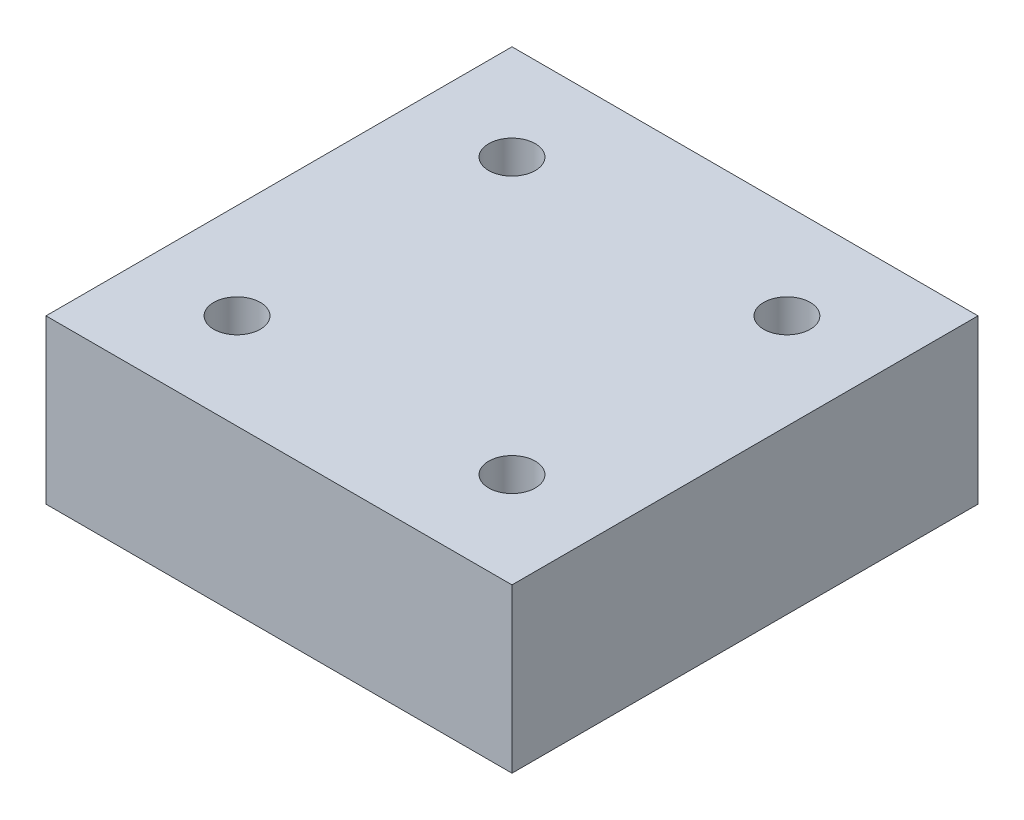
ISO-10303-21;
HEADER;
FILE_DESCRIPTION(('STEP AP214'),'2;1');
FILE_NAME('part.step','',(''),(''),'','','');
FILE_SCHEMA(('AUTOMOTIVE_DESIGN { 1 0 10303 214 1 1 1 1 }'));
ENDSEC;
DATA;
#1=APPLICATION_CONTEXT('core data for automotive mechanical design processes');
#2=APPLICATION_PROTOCOL_DEFINITION('international standard','automotive_design',2000,#1);
#3=PRODUCT_CONTEXT('',#1,'mechanical');
#4=PRODUCT('Part','Part','',(#3));
#5=PRODUCT_RELATED_PRODUCT_CATEGORY('part','',(#4));
#6=PRODUCT_DEFINITION_FORMATION('','',#4);
#7=PRODUCT_DEFINITION_CONTEXT('part definition',#1,'design');
#8=PRODUCT_DEFINITION('design','',#6,#7);
#9=PRODUCT_DEFINITION_SHAPE('','',#8);
#10=(LENGTH_UNIT() NAMED_UNIT(*) SI_UNIT(.MILLI.,.METRE.));
#11=(NAMED_UNIT(*) PLANE_ANGLE_UNIT() SI_UNIT($,.RADIAN.));
#12=(NAMED_UNIT(*) SI_UNIT($,.STERADIAN.) SOLID_ANGLE_UNIT());
#13=UNCERTAINTY_MEASURE_WITH_UNIT(LENGTH_MEASURE(1.E-05),#10,'distance_accuracy_value','');
#14=(GEOMETRIC_REPRESENTATION_CONTEXT(3) GLOBAL_UNCERTAINTY_ASSIGNED_CONTEXT((#13)) GLOBAL_UNIT_ASSIGNED_CONTEXT((#10,
#11,#12)) REPRESENTATION_CONTEXT('',''));
#15=CARTESIAN_POINT('',(0.,0.,0.));
#16=DIRECTION('',(0.,0.,1.));
#17=DIRECTION('',(1.,0.,0.));
#18=AXIS2_PLACEMENT_3D('',#15,#16,#17);
#19=CARTESIAN_POINT('',(25.4,17.78,25.4));
#20=DIRECTION('',(-1.,0.,0.));
#21=DIRECTION('',(0.,0.,1.));
#22=AXIS2_PLACEMENT_3D('',#19,#20,#21);
#23=PLANE('',#22);
#24=DIRECTION('',(0.,0.,-1.));
#25=VECTOR('',#24,1.);
#26=CARTESIAN_POINT('',(25.4,0.,25.4));
#27=LINE('',#26,#25);
#28=CARTESIAN_POINT('',(25.4,0.,25.4));
#29=VERTEX_POINT('',#28);
#30=CARTESIAN_POINT('',(25.4,0.,-25.4));
#31=VERTEX_POINT('',#30);
#32=EDGE_CURVE('E96',#29,#31,#27,.T.);
#33=ORIENTED_EDGE('',*,*,#32,.T.);
#34=DIRECTION('',(0.,-1.,0.));
#35=VECTOR('',#34,1.);
#36=CARTESIAN_POINT('',(25.4,17.78,-25.4));
#37=LINE('',#36,#35);
#38=CARTESIAN_POINT('',(25.4,17.78,-25.4));
#39=VERTEX_POINT('',#38);
#40=EDGE_CURVE('E11',#39,#31,#37,.T.);
#41=ORIENTED_EDGE('',*,*,#40,.F.);
#42=DIRECTION('',(0.,0.,-1.));
#43=VECTOR('',#42,1.);
#44=CARTESIAN_POINT('',(25.4,17.78,25.4));
#45=LINE('',#44,#43);
#46=CARTESIAN_POINT('',(25.4,17.78,25.4));
#47=VERTEX_POINT('',#46);
#48=EDGE_CURVE('E84',#47,#39,#45,.T.);
#49=ORIENTED_EDGE('',*,*,#48,.F.);
#50=DIRECTION('',(0.,-1.,0.));
#51=VECTOR('',#50,1.);
#52=CARTESIAN_POINT('',(25.4,17.78,25.4));
#53=LINE('',#52,#51);
#54=EDGE_CURVE('E92',#47,#29,#53,.T.);
#55=ORIENTED_EDGE('',*,*,#54,.T.);
#56=EDGE_LOOP('',(#33,#41,#49,#55));
#57=FACE_BOUND('',#56,.T.);
#58=ADVANCED_FACE('F33',(#57),#23,.F.);
#59=CARTESIAN_POINT('',(-25.4,17.78,-25.4));
#60=DIRECTION('',(0.,0.,1.));
#61=DIRECTION('',(1.,0.,0.));
#62=AXIS2_PLACEMENT_3D('',#59,#60,#61);
#63=PLANE('',#62);
#64=DIRECTION('',(-1.,0.,0.));
#65=VECTOR('',#64,1.);
#66=CARTESIAN_POINT('',(-25.4,0.,-25.4));
#67=LINE('',#66,#65);
#68=CARTESIAN_POINT('',(-25.4,0.,-25.4));
#69=VERTEX_POINT('',#68);
#70=EDGE_CURVE('E88',#31,#69,#67,.T.);
#71=ORIENTED_EDGE('',*,*,#70,.T.);
#72=DIRECTION('',(0.,-1.,0.));
#73=VECTOR('',#72,1.);
#74=CARTESIAN_POINT('',(-25.4,17.78,-25.4));
#75=LINE('',#74,#73);
#76=CARTESIAN_POINT('',(-25.4,17.78,-25.4));
#77=VERTEX_POINT('',#76);
#78=EDGE_CURVE('E41',#77,#69,#75,.T.);
#79=ORIENTED_EDGE('',*,*,#78,.F.);
#80=DIRECTION('',(-1.,0.,0.));
#81=VECTOR('',#80,1.);
#82=CARTESIAN_POINT('',(-25.4,17.78,-25.4));
#83=LINE('',#82,#81);
#84=EDGE_CURVE('E79',#39,#77,#83,.T.);
#85=ORIENTED_EDGE('',*,*,#84,.F.);
#86=ORIENTED_EDGE('',*,*,#40,.T.);
#87=EDGE_LOOP('',(#71,#79,#85,#86));
#88=FACE_BOUND('',#87,.T.);
#89=ADVANCED_FACE('F87',(#88),#63,.F.);
#90=CARTESIAN_POINT('',(-25.4,17.78,25.4));
#91=DIRECTION('',(1.,0.,0.));
#92=DIRECTION('',(0.,0.,-1.));
#93=AXIS2_PLACEMENT_3D('',#90,#91,#92);
#94=PLANE('',#93);
#95=DIRECTION('',(0.,0.,1.));
#96=VECTOR('',#95,1.);
#97=CARTESIAN_POINT('',(-25.4,0.,25.4));
#98=LINE('',#97,#96);
#99=CARTESIAN_POINT('',(-25.4,0.,25.4));
#100=VERTEX_POINT('',#99);
#101=EDGE_CURVE('E66',#69,#100,#98,.T.);
#102=ORIENTED_EDGE('',*,*,#101,.T.);
#103=DIRECTION('',(0.,-1.,0.));
#104=VECTOR('',#103,1.);
#105=CARTESIAN_POINT('',(-25.4,17.78,25.4));
#106=LINE('',#105,#104);
#107=CARTESIAN_POINT('',(-25.4,17.78,25.4));
#108=VERTEX_POINT('',#107);
#109=EDGE_CURVE('E89',#108,#100,#106,.T.);
#110=ORIENTED_EDGE('',*,*,#109,.F.);
#111=DIRECTION('',(0.,0.,1.));
#112=VECTOR('',#111,1.);
#113=CARTESIAN_POINT('',(-25.4,17.78,25.4));
#114=LINE('',#113,#112);
#115=EDGE_CURVE('E82',#77,#108,#114,.T.);
#116=ORIENTED_EDGE('',*,*,#115,.F.);
#117=ORIENTED_EDGE('',*,*,#78,.T.);
#118=EDGE_LOOP('',(#102,#110,#116,#117));
#119=FACE_BOUND('',#118,.T.);
#120=ADVANCED_FACE('F90',(#119),#94,.F.);
#121=CARTESIAN_POINT('',(-25.4,17.78,25.4));
#122=DIRECTION('',(0.,0.,-1.));
#123=DIRECTION('',(-1.,0.,0.));
#124=AXIS2_PLACEMENT_3D('',#121,#122,#123);
#125=PLANE('',#124);
#126=DIRECTION('',(1.,0.,0.));
#127=VECTOR('',#126,1.);
#128=CARTESIAN_POINT('',(-25.4,0.,25.4));
#129=LINE('',#128,#127);
#130=EDGE_CURVE('E72',#100,#29,#129,.T.);
#131=ORIENTED_EDGE('',*,*,#130,.T.);
#132=ORIENTED_EDGE('',*,*,#54,.F.);
#133=DIRECTION('',(1.,0.,0.));
#134=VECTOR('',#133,1.);
#135=CARTESIAN_POINT('',(-25.4,17.78,25.4));
#136=LINE('',#135,#134);
#137=EDGE_CURVE('E49',#108,#47,#136,.T.);
#138=ORIENTED_EDGE('',*,*,#137,.F.);
#139=ORIENTED_EDGE('',*,*,#109,.T.);
#140=EDGE_LOOP('',(#131,#132,#138,#139));
#141=FACE_BOUND('',#140,.T.);
#142=ADVANCED_FACE('F104',(#141),#125,.F.);
#143=CARTESIAN_POINT('',(0.,17.78,0.));
#144=DIRECTION('',(0.,-1.,0.));
#145=DIRECTION('',(0.,0.,-1.));
#146=AXIS2_PLACEMENT_3D('',#143,#144,#145);
#147=PLANE('',#146);
#148=CARTESIAN_POINT('',(-14.986,17.78,14.986));
#149=DIRECTION('',(0.,1.,0.));
#150=DIRECTION('',(0.,0.,1.));
#151=AXIS2_PLACEMENT_3D('',#148,#149,#150);
#152=CIRCLE('',#151,2.54);
#153=CARTESIAN_POINT('',(-14.986,17.78,17.526));
#154=VERTEX_POINT('',#153);
#155=EDGE_CURVE('E116',#154,#154,#152,.T.);
#156=ORIENTED_EDGE('',*,*,#155,.F.);
#157=EDGE_LOOP('',(#156));
#158=FACE_BOUND('',#157,.T.);
#159=CARTESIAN_POINT('',(14.986,17.78,14.986));
#160=DIRECTION('',(0.,1.,0.));
#161=DIRECTION('',(0.,0.,1.));
#162=AXIS2_PLACEMENT_3D('',#159,#160,#161);
#163=CIRCLE('',#162,2.54);
#164=CARTESIAN_POINT('',(14.986,17.78,17.526));
#165=VERTEX_POINT('',#164);
#166=EDGE_CURVE('E122',#165,#165,#163,.T.);
#167=ORIENTED_EDGE('',*,*,#166,.F.);
#168=EDGE_LOOP('',(#167));
#169=FACE_BOUND('',#168,.T.);
#170=CARTESIAN_POINT('',(14.986,17.78,-14.986));
#171=DIRECTION('',(0.,1.,0.));
#172=DIRECTION('',(0.,0.,1.));
#173=AXIS2_PLACEMENT_3D('',#170,#171,#172);
#174=CIRCLE('',#173,2.54);
#175=CARTESIAN_POINT('',(14.986,17.78,-12.446));
#176=VERTEX_POINT('',#175);
#177=EDGE_CURVE('E128',#176,#176,#174,.T.);
#178=ORIENTED_EDGE('',*,*,#177,.F.);
#179=EDGE_LOOP('',(#178));
#180=FACE_BOUND('',#179,.T.);
#181=CARTESIAN_POINT('',(-14.986,17.78,-14.986));
#182=DIRECTION('',(0.,1.,0.));
#183=DIRECTION('',(0.,0.,1.));
#184=AXIS2_PLACEMENT_3D('',#181,#182,#183);
#185=CIRCLE('',#184,2.54);
#186=CARTESIAN_POINT('',(-14.986,17.78,-12.446));
#187=VERTEX_POINT('',#186);
#188=EDGE_CURVE('E110',#187,#187,#185,.T.);
#189=ORIENTED_EDGE('',*,*,#188,.F.);
#190=EDGE_LOOP('',(#189));
#191=FACE_BOUND('',#190,.T.);
#192=ORIENTED_EDGE('',*,*,#48,.T.);
#193=ORIENTED_EDGE('',*,*,#84,.T.);
#194=ORIENTED_EDGE('',*,*,#115,.T.);
#195=ORIENTED_EDGE('',*,*,#137,.T.);
#196=EDGE_LOOP('',(#192,#193,#194,#195));
#197=FACE_BOUND('',#196,.T.);
#198=ADVANCED_FACE('F80',(#158,#169,#180,#191,#197),#147,.F.);
#199=CARTESIAN_POINT('',(0.,0.,0.));
#200=DIRECTION('',(0.,-1.,0.));
#201=DIRECTION('',(0.,0.,-1.));
#202=AXIS2_PLACEMENT_3D('',#199,#200,#201);
#203=PLANE('',#202);
#204=CARTESIAN_POINT('',(-14.986,0.,14.986));
#205=DIRECTION('',(0.,1.,0.));
#206=DIRECTION('',(0.,0.,1.));
#207=AXIS2_PLACEMENT_3D('',#204,#205,#206);
#208=CIRCLE('',#207,2.54);
#209=CARTESIAN_POINT('',(-14.986,0.,17.526));
#210=VERTEX_POINT('',#209);
#211=EDGE_CURVE('E119',#210,#210,#208,.T.);
#212=ORIENTED_EDGE('',*,*,#211,.T.);
#213=EDGE_LOOP('',(#212));
#214=FACE_BOUND('',#213,.T.);
#215=CARTESIAN_POINT('',(14.986,0.,14.986));
#216=DIRECTION('',(0.,1.,0.));
#217=DIRECTION('',(0.,0.,1.));
#218=AXIS2_PLACEMENT_3D('',#215,#216,#217);
#219=CIRCLE('',#218,2.54);
#220=CARTESIAN_POINT('',(14.986,0.,17.526));
#221=VERTEX_POINT('',#220);
#222=EDGE_CURVE('E125',#221,#221,#219,.T.);
#223=ORIENTED_EDGE('',*,*,#222,.T.);
#224=EDGE_LOOP('',(#223));
#225=FACE_BOUND('',#224,.T.);
#226=CARTESIAN_POINT('',(14.986,0.,-14.986));
#227=DIRECTION('',(0.,1.,0.));
#228=DIRECTION('',(0.,0.,1.));
#229=AXIS2_PLACEMENT_3D('',#226,#227,#228);
#230=CIRCLE('',#229,2.54);
#231=CARTESIAN_POINT('',(14.986,0.,-12.446));
#232=VERTEX_POINT('',#231);
#233=EDGE_CURVE('E113',#232,#232,#230,.T.);
#234=ORIENTED_EDGE('',*,*,#233,.T.);
#235=EDGE_LOOP('',(#234));
#236=FACE_BOUND('',#235,.T.);
#237=CARTESIAN_POINT('',(-14.986,0.,-14.986));
#238=DIRECTION('',(0.,1.,0.));
#239=DIRECTION('',(0.,0.,1.));
#240=AXIS2_PLACEMENT_3D('',#237,#238,#239);
#241=CIRCLE('',#240,2.54);
#242=CARTESIAN_POINT('',(-14.986,0.,-12.446));
#243=VERTEX_POINT('',#242);
#244=EDGE_CURVE('E99',#243,#243,#241,.T.);
#245=ORIENTED_EDGE('',*,*,#244,.T.);
#246=EDGE_LOOP('',(#245));
#247=FACE_BOUND('',#246,.T.);
#248=ORIENTED_EDGE('',*,*,#32,.F.);
#249=ORIENTED_EDGE('',*,*,#130,.F.);
#250=ORIENTED_EDGE('',*,*,#101,.F.);
#251=ORIENTED_EDGE('',*,*,#70,.F.);
#252=EDGE_LOOP('',(#248,#249,#250,#251));
#253=FACE_BOUND('',#252,.T.);
#254=ADVANCED_FACE('F107',(#214,#225,#236,#247,#253),#203,.T.);
#255=CARTESIAN_POINT('',(-14.986,0.,-14.986));
#256=DIRECTION('',(0.,1.,0.));
#257=DIRECTION('',(0.,0.,1.));
#258=AXIS2_PLACEMENT_3D('',#255,#256,#257);
#259=CYLINDRICAL_SURFACE('',#258,2.54);
#260=ORIENTED_EDGE('',*,*,#244,.F.);
#261=EDGE_LOOP('',(#260));
#262=FACE_BOUND('',#261,.T.);
#263=ORIENTED_EDGE('',*,*,#188,.T.);
#264=EDGE_LOOP('',(#263));
#265=FACE_BOUND('',#264,.T.);
#266=ADVANCED_FACE('F140',(#262,#265),#259,.F.);
#267=CARTESIAN_POINT('',(14.986,0.,-14.986));
#268=DIRECTION('',(0.,1.,0.));
#269=DIRECTION('',(0.,0.,1.));
#270=AXIS2_PLACEMENT_3D('',#267,#268,#269);
#271=CYLINDRICAL_SURFACE('',#270,2.54);
#272=ORIENTED_EDGE('',*,*,#233,.F.);
#273=EDGE_LOOP('',(#272));
#274=FACE_BOUND('',#273,.T.);
#275=ORIENTED_EDGE('',*,*,#177,.T.);
#276=EDGE_LOOP('',(#275));
#277=FACE_BOUND('',#276,.T.);
#278=ADVANCED_FACE('F136',(#274,#277),#271,.F.);
#279=CARTESIAN_POINT('',(14.986,0.,14.986));
#280=DIRECTION('',(0.,1.,0.));
#281=DIRECTION('',(0.,0.,1.));
#282=AXIS2_PLACEMENT_3D('',#279,#280,#281);
#283=CYLINDRICAL_SURFACE('',#282,2.54);
#284=ORIENTED_EDGE('',*,*,#222,.F.);
#285=EDGE_LOOP('',(#284));
#286=FACE_BOUND('',#285,.T.);
#287=ORIENTED_EDGE('',*,*,#166,.T.);
#288=EDGE_LOOP('',(#287));
#289=FACE_BOUND('',#288,.T.);
#290=ADVANCED_FACE('F139',(#286,#289),#283,.F.);
#291=CARTESIAN_POINT('',(-14.986,0.,14.986));
#292=DIRECTION('',(0.,1.,0.));
#293=DIRECTION('',(0.,0.,1.));
#294=AXIS2_PLACEMENT_3D('',#291,#292,#293);
#295=CYLINDRICAL_SURFACE('',#294,2.54);
#296=ORIENTED_EDGE('',*,*,#211,.F.);
#297=EDGE_LOOP('',(#296));
#298=FACE_BOUND('',#297,.T.);
#299=ORIENTED_EDGE('',*,*,#155,.T.);
#300=EDGE_LOOP('',(#299));
#301=FACE_BOUND('',#300,.T.);
#302=ADVANCED_FACE('F201',(#298,#301),#295,.F.);
#303=CLOSED_SHELL('',(#58,#89,#120,#142,#198,#254,#266,#278,#290,#302));
#304=MANIFOLD_SOLID_BREP('B2',#303);
#305=ADVANCED_BREP_SHAPE_REPRESENTATION('',(#18,#304),#14);
#306=SHAPE_DEFINITION_REPRESENTATION(#9,#305);
ENDSEC;
END-ISO-10303-21;
